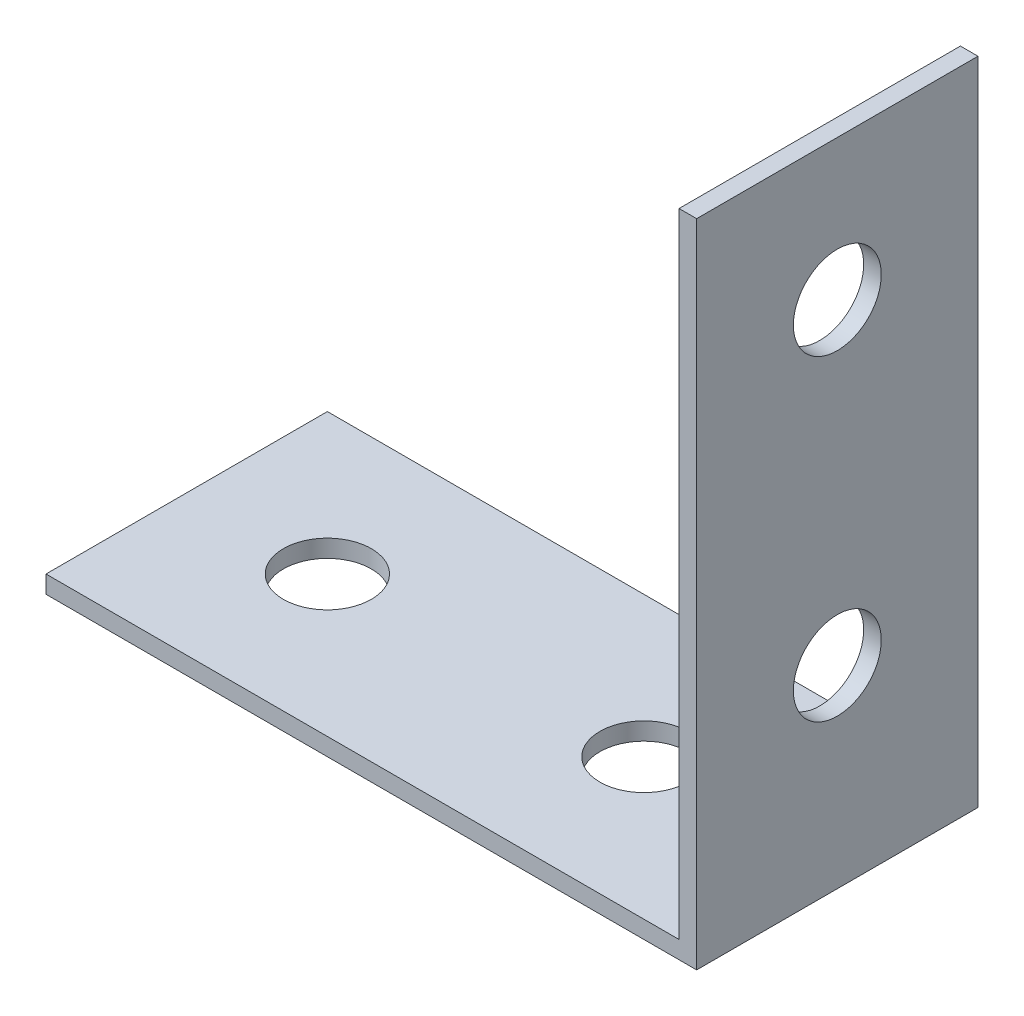
ISO-10303-21;
HEADER;
FILE_DESCRIPTION(('STEP AP214'),'2;1');
FILE_NAME('part.step','',(''),(''),'','','');
FILE_SCHEMA(('AUTOMOTIVE_DESIGN { 1 0 10303 214 1 1 1 1 }'));
ENDSEC;
DATA;
#1=APPLICATION_CONTEXT('core data for automotive mechanical design processes');
#2=APPLICATION_PROTOCOL_DEFINITION('international standard','automotive_design',2000,#1);
#3=PRODUCT_CONTEXT('',#1,'mechanical');
#4=PRODUCT('Part','Part','',(#3));
#5=PRODUCT_RELATED_PRODUCT_CATEGORY('part','',(#4));
#6=PRODUCT_DEFINITION_FORMATION('','',#4);
#7=PRODUCT_DEFINITION_CONTEXT('part definition',#1,'design');
#8=PRODUCT_DEFINITION('design','',#6,#7);
#9=PRODUCT_DEFINITION_SHAPE('','',#8);
#10=(LENGTH_UNIT() NAMED_UNIT(*) SI_UNIT(.MILLI.,.METRE.));
#11=(NAMED_UNIT(*) PLANE_ANGLE_UNIT() SI_UNIT($,.RADIAN.));
#12=(NAMED_UNIT(*) SI_UNIT($,.STERADIAN.) SOLID_ANGLE_UNIT());
#13=UNCERTAINTY_MEASURE_WITH_UNIT(LENGTH_MEASURE(1.E-05),#10,'distance_accuracy_value','');
#14=(GEOMETRIC_REPRESENTATION_CONTEXT(3) GLOBAL_UNCERTAINTY_ASSIGNED_CONTEXT((#13)) GLOBAL_UNIT_ASSIGNED_CONTEXT((#10,
#11,#12)) REPRESENTATION_CONTEXT('',''));
#15=CARTESIAN_POINT('',(0.,0.,0.));
#16=DIRECTION('',(0.,0.,1.));
#17=DIRECTION('',(1.,0.,0.));
#18=AXIS2_PLACEMENT_3D('',#15,#16,#17);
#19=CARTESIAN_POINT('',(-18.,1.,-8.));
#20=DIRECTION('',(0.,0.,1.));
#21=DIRECTION('',(1.,0.,0.));
#22=AXIS2_PLACEMENT_3D('',#19,#20,#21);
#23=PLANE('',#22);
#24=DIRECTION('',(-1.,0.,0.));
#25=VECTOR('',#24,1.);
#26=CARTESIAN_POINT('',(-18.,0.,-8.));
#27=LINE('',#26,#25);
#28=CARTESIAN_POINT('',(19.,0.,-8.));
#29=VERTEX_POINT('',#28);
#30=CARTESIAN_POINT('',(-18.,0.,-8.));
#31=VERTEX_POINT('',#30);
#32=EDGE_CURVE('E65',#29,#31,#27,.T.);
#33=ORIENTED_EDGE('',*,*,#32,.T.);
#34=DIRECTION('',(0.,-1.,0.));
#35=VECTOR('',#34,1.);
#36=CARTESIAN_POINT('',(-18.,1.,-8.));
#37=LINE('',#36,#35);
#38=CARTESIAN_POINT('',(-18.,1.,-8.));
#39=VERTEX_POINT('',#38);
#40=EDGE_CURVE('E11',#39,#31,#37,.T.);
#41=ORIENTED_EDGE('',*,*,#40,.F.);
#42=DIRECTION('',(-1.,0.,0.));
#43=VECTOR('',#42,1.);
#44=CARTESIAN_POINT('',(-18.,1.,-8.));
#45=LINE('',#44,#43);
#46=CARTESIAN_POINT('',(18.,1.,-8.));
#47=VERTEX_POINT('',#46);
#48=EDGE_CURVE('E94',#47,#39,#45,.T.);
#49=ORIENTED_EDGE('',*,*,#48,.F.);
#50=DIRECTION('',(0.,1.,0.));
#51=VECTOR('',#50,1.);
#52=CARTESIAN_POINT('',(18.,0.,-8.));
#53=LINE('',#52,#51);
#54=CARTESIAN_POINT('',(18.,37.,-8.));
#55=VERTEX_POINT('',#54);
#56=EDGE_CURVE('E84',#47,#55,#53,.T.);
#57=ORIENTED_EDGE('',*,*,#56,.T.);
#58=DIRECTION('',(-1.,0.,0.));
#59=VECTOR('',#58,1.);
#60=CARTESIAN_POINT('',(19.,37.,-8.));
#61=LINE('',#60,#59);
#62=CARTESIAN_POINT('',(19.,37.,-8.));
#63=VERTEX_POINT('',#62);
#64=EDGE_CURVE('E105',#63,#55,#61,.T.);
#65=ORIENTED_EDGE('',*,*,#64,.F.);
#66=DIRECTION('',(0.,1.,0.));
#67=VECTOR('',#66,1.);
#68=CARTESIAN_POINT('',(19.,0.,-8.));
#69=LINE('',#68,#67);
#70=EDGE_CURVE('E129',#29,#63,#69,.T.);
#71=ORIENTED_EDGE('',*,*,#70,.F.);
#72=EDGE_LOOP('',(#33,#41,#49,#57,#65,#71));
#73=FACE_BOUND('',#72,.T.);
#74=ADVANCED_FACE('F37',(#73),#23,.F.);
#75=CARTESIAN_POINT('',(-18.,1.,-8.));
#76=DIRECTION('',(1.,0.,0.));
#77=DIRECTION('',(0.,0.,-1.));
#78=AXIS2_PLACEMENT_3D('',#75,#76,#77);
#79=PLANE('',#78);
#80=DIRECTION('',(0.,0.,1.));
#81=VECTOR('',#80,1.);
#82=CARTESIAN_POINT('',(-18.,0.,-8.));
#83=LINE('',#82,#81);
#84=CARTESIAN_POINT('',(-18.,0.,8.));
#85=VERTEX_POINT('',#84);
#86=EDGE_CURVE('E102',#31,#85,#83,.T.);
#87=ORIENTED_EDGE('',*,*,#86,.T.);
#88=DIRECTION('',(0.,-1.,0.));
#89=VECTOR('',#88,1.);
#90=CARTESIAN_POINT('',(-18.,1.,8.));
#91=LINE('',#90,#89);
#92=CARTESIAN_POINT('',(-18.,1.,8.));
#93=VERTEX_POINT('',#92);
#94=EDGE_CURVE('E45',#93,#85,#91,.T.);
#95=ORIENTED_EDGE('',*,*,#94,.F.);
#96=DIRECTION('',(0.,0.,1.));
#97=VECTOR('',#96,1.);
#98=CARTESIAN_POINT('',(-18.,1.,-8.));
#99=LINE('',#98,#97);
#100=EDGE_CURVE('E53',#39,#93,#99,.T.);
#101=ORIENTED_EDGE('',*,*,#100,.F.);
#102=ORIENTED_EDGE('',*,*,#40,.T.);
#103=EDGE_LOOP('',(#87,#95,#101,#102));
#104=FACE_BOUND('',#103,.T.);
#105=ADVANCED_FACE('F164',(#104),#79,.F.);
#106=CARTESIAN_POINT('',(-18.,1.,8.));
#107=DIRECTION('',(0.,0.,-1.));
#108=DIRECTION('',(-1.,0.,0.));
#109=AXIS2_PLACEMENT_3D('',#106,#107,#108);
#110=PLANE('',#109);
#111=DIRECTION('',(1.,0.,0.));
#112=VECTOR('',#111,1.);
#113=CARTESIAN_POINT('',(-18.,0.,8.));
#114=LINE('',#113,#112);
#115=CARTESIAN_POINT('',(19.,0.,8.));
#116=VERTEX_POINT('',#115);
#117=EDGE_CURVE('E99',#85,#116,#114,.T.);
#118=ORIENTED_EDGE('',*,*,#117,.T.);
#119=DIRECTION('',(0.,-1.,0.));
#120=VECTOR('',#119,1.);
#121=CARTESIAN_POINT('',(19.,0.,8.));
#122=LINE('',#121,#120);
#123=CARTESIAN_POINT('',(19.,37.,8.));
#124=VERTEX_POINT('',#123);
#125=EDGE_CURVE('E130',#124,#116,#122,.T.);
#126=ORIENTED_EDGE('',*,*,#125,.F.);
#127=DIRECTION('',(-1.,0.,0.));
#128=VECTOR('',#127,1.);
#129=CARTESIAN_POINT('',(19.,37.,8.));
#130=LINE('',#129,#128);
#131=CARTESIAN_POINT('',(18.,37.,8.));
#132=VERTEX_POINT('',#131);
#133=EDGE_CURVE('E145',#124,#132,#130,.T.);
#134=ORIENTED_EDGE('',*,*,#133,.T.);
#135=DIRECTION('',(0.,-1.,0.));
#136=VECTOR('',#135,1.);
#137=CARTESIAN_POINT('',(18.,0.,8.));
#138=LINE('',#137,#136);
#139=CARTESIAN_POINT('',(18.,1.,8.));
#140=VERTEX_POINT('',#139);
#141=EDGE_CURVE('E92',#132,#140,#138,.T.);
#142=ORIENTED_EDGE('',*,*,#141,.T.);
#143=DIRECTION('',(1.,0.,0.));
#144=VECTOR('',#143,1.);
#145=CARTESIAN_POINT('',(-18.,1.,8.));
#146=LINE('',#145,#144);
#147=EDGE_CURVE('E98',#93,#140,#146,.T.);
#148=ORIENTED_EDGE('',*,*,#147,.F.);
#149=ORIENTED_EDGE('',*,*,#94,.T.);
#150=EDGE_LOOP('',(#118,#126,#134,#142,#148,#149));
#151=FACE_BOUND('',#150,.T.);
#152=ADVANCED_FACE('F114',(#151),#110,.F.);
#153=CARTESIAN_POINT('',(0.,1.,0.));
#154=DIRECTION('',(0.,1.,0.));
#155=DIRECTION('',(0.,0.,1.));
#156=AXIS2_PLACEMENT_3D('',#153,#154,#155);
#157=PLANE('',#156);
#158=CARTESIAN_POINT('',(-10.,1.,0.));
#159=DIRECTION('',(0.,1.,0.));
#160=DIRECTION('',(0.,0.,1.));
#161=AXIS2_PLACEMENT_3D('',#158,#159,#160);
#162=CIRCLE('',#161,2.5);
#163=CARTESIAN_POINT('',(-10.,1.,2.5));
#164=VERTEX_POINT('',#163);
#165=EDGE_CURVE('E182',#164,#164,#162,.T.);
#166=ORIENTED_EDGE('',*,*,#165,.F.);
#167=EDGE_LOOP('',(#166));
#168=FACE_BOUND('',#167,.T.);
#169=CARTESIAN_POINT('',(8.,1.,0.));
#170=DIRECTION('',(0.,1.,0.));
#171=DIRECTION('',(0.,0.,1.));
#172=AXIS2_PLACEMENT_3D('',#169,#170,#171);
#173=CIRCLE('',#172,2.5);
#174=CARTESIAN_POINT('',(8.,1.,2.5));
#175=VERTEX_POINT('',#174);
#176=EDGE_CURVE('E185',#175,#175,#173,.T.);
#177=ORIENTED_EDGE('',*,*,#176,.F.);
#178=EDGE_LOOP('',(#177));
#179=FACE_BOUND('',#178,.T.);
#180=DIRECTION('',(0.,0.,-1.));
#181=VECTOR('',#180,1.);
#182=CARTESIAN_POINT('',(18.,1.,-8.));
#183=LINE('',#182,#181);
#184=EDGE_CURVE('E74',#140,#47,#183,.T.);
#185=ORIENTED_EDGE('',*,*,#184,.T.);
#186=ORIENTED_EDGE('',*,*,#48,.T.);
#187=ORIENTED_EDGE('',*,*,#100,.T.);
#188=ORIENTED_EDGE('',*,*,#147,.T.);
#189=EDGE_LOOP('',(#185,#186,#187,#188));
#190=FACE_BOUND('',#189,.T.);
#191=ADVANCED_FACE('F96',(#168,#179,#190),#157,.T.);
#192=CARTESIAN_POINT('',(0.,0.,0.));
#193=DIRECTION('',(0.,1.,0.));
#194=DIRECTION('',(0.,0.,1.));
#195=AXIS2_PLACEMENT_3D('',#192,#193,#194);
#196=PLANE('',#195);
#197=CARTESIAN_POINT('',(-10.,0.,0.));
#198=DIRECTION('',(0.,1.,0.));
#199=DIRECTION('',(0.,0.,1.));
#200=AXIS2_PLACEMENT_3D('',#197,#198,#199);
#201=CIRCLE('',#200,2.5);
#202=CARTESIAN_POINT('',(-10.,0.,2.5));
#203=VERTEX_POINT('',#202);
#204=EDGE_CURVE('E146',#203,#203,#201,.F.);
#205=ORIENTED_EDGE('',*,*,#204,.F.);
#206=EDGE_LOOP('',(#205));
#207=FACE_BOUND('',#206,.T.);
#208=CARTESIAN_POINT('',(8.,0.,0.));
#209=DIRECTION('',(0.,1.,0.));
#210=DIRECTION('',(0.,0.,1.));
#211=AXIS2_PLACEMENT_3D('',#208,#209,#210);
#212=CIRCLE('',#211,2.5);
#213=CARTESIAN_POINT('',(8.,0.,2.5));
#214=VERTEX_POINT('',#213);
#215=EDGE_CURVE('E140',#214,#214,#212,.F.);
#216=ORIENTED_EDGE('',*,*,#215,.F.);
#217=EDGE_LOOP('',(#216));
#218=FACE_BOUND('',#217,.T.);
#219=ORIENTED_EDGE('',*,*,#32,.F.);
#220=DIRECTION('',(0.,0.,-1.));
#221=VECTOR('',#220,1.);
#222=CARTESIAN_POINT('',(19.,0.,8.));
#223=LINE('',#222,#221);
#224=EDGE_CURVE('E123',#116,#29,#223,.T.);
#225=ORIENTED_EDGE('',*,*,#224,.F.);
#226=ORIENTED_EDGE('',*,*,#117,.F.);
#227=ORIENTED_EDGE('',*,*,#86,.F.);
#228=EDGE_LOOP('',(#219,#225,#226,#227));
#229=FACE_BOUND('',#228,.T.);
#230=ADVANCED_FACE('F121',(#207,#218,#229),#196,.F.);
#231=CARTESIAN_POINT('',(18.,0.,0.));
#232=DIRECTION('',(-1.,0.,0.));
#233=DIRECTION('',(0.,0.,1.));
#234=AXIS2_PLACEMENT_3D('',#231,#232,#233);
#235=PLANE('',#234);
#236=CARTESIAN_POINT('',(18.,29.,0.));
#237=DIRECTION('',(-1.,0.,0.));
#238=DIRECTION('',(0.,0.,1.));
#239=AXIS2_PLACEMENT_3D('',#236,#237,#238);
#240=CIRCLE('',#239,2.5);
#241=CARTESIAN_POINT('',(18.,29.,2.5));
#242=VERTEX_POINT('',#241);
#243=EDGE_CURVE('E190',#242,#242,#240,.T.);
#244=ORIENTED_EDGE('',*,*,#243,.F.);
#245=EDGE_LOOP('',(#244));
#246=FACE_BOUND('',#245,.T.);
#247=CARTESIAN_POINT('',(18.,11.,0.));
#248=DIRECTION('',(-1.,0.,0.));
#249=DIRECTION('',(0.,0.,1.));
#250=AXIS2_PLACEMENT_3D('',#247,#248,#249);
#251=CIRCLE('',#250,2.5);
#252=CARTESIAN_POINT('',(18.,11.,2.5));
#253=VERTEX_POINT('',#252);
#254=EDGE_CURVE('E199',#253,#253,#251,.T.);
#255=ORIENTED_EDGE('',*,*,#254,.F.);
#256=EDGE_LOOP('',(#255));
#257=FACE_BOUND('',#256,.T.);
#258=ORIENTED_EDGE('',*,*,#184,.F.);
#259=ORIENTED_EDGE('',*,*,#141,.F.);
#260=DIRECTION('',(0.,0.,1.));
#261=VECTOR('',#260,1.);
#262=CARTESIAN_POINT('',(18.,37.,8.));
#263=LINE('',#262,#261);
#264=EDGE_CURVE('E89',#55,#132,#263,.T.);
#265=ORIENTED_EDGE('',*,*,#264,.F.);
#266=ORIENTED_EDGE('',*,*,#56,.F.);
#267=EDGE_LOOP('',(#258,#259,#265,#266));
#268=FACE_BOUND('',#267,.T.);
#269=ADVANCED_FACE('F86',(#246,#257,#268),#235,.T.);
#270=CARTESIAN_POINT('',(19.,37.,8.));
#271=DIRECTION('',(0.,-1.,0.));
#272=DIRECTION('',(0.,0.,-1.));
#273=AXIS2_PLACEMENT_3D('',#270,#271,#272);
#274=PLANE('',#273);
#275=ORIENTED_EDGE('',*,*,#264,.T.);
#276=ORIENTED_EDGE('',*,*,#133,.F.);
#277=DIRECTION('',(0.,0.,1.));
#278=VECTOR('',#277,1.);
#279=CARTESIAN_POINT('',(19.,37.,8.));
#280=LINE('',#279,#278);
#281=EDGE_CURVE('E134',#63,#124,#280,.T.);
#282=ORIENTED_EDGE('',*,*,#281,.F.);
#283=ORIENTED_EDGE('',*,*,#64,.T.);
#284=EDGE_LOOP('',(#275,#276,#282,#283));
#285=FACE_BOUND('',#284,.T.);
#286=ADVANCED_FACE('F148',(#285),#274,.F.);
#287=CARTESIAN_POINT('',(19.,0.,0.));
#288=DIRECTION('',(-1.,0.,0.));
#289=DIRECTION('',(0.,0.,1.));
#290=AXIS2_PLACEMENT_3D('',#287,#288,#289);
#291=PLANE('',#290);
#292=CARTESIAN_POINT('',(19.,29.,0.));
#293=DIRECTION('',(-1.,0.,0.));
#294=DIRECTION('',(0.,0.,1.));
#295=AXIS2_PLACEMENT_3D('',#292,#293,#294);
#296=CIRCLE('',#295,2.5);
#297=CARTESIAN_POINT('',(19.,29.,2.5));
#298=VERTEX_POINT('',#297);
#299=EDGE_CURVE('E187',#298,#298,#296,.F.);
#300=ORIENTED_EDGE('',*,*,#299,.F.);
#301=EDGE_LOOP('',(#300));
#302=FACE_BOUND('',#301,.T.);
#303=CARTESIAN_POINT('',(19.,11.,0.));
#304=DIRECTION('',(-1.,0.,0.));
#305=DIRECTION('',(0.,0.,1.));
#306=AXIS2_PLACEMENT_3D('',#303,#304,#305);
#307=CIRCLE('',#306,2.5);
#308=CARTESIAN_POINT('',(19.,11.,2.5));
#309=VERTEX_POINT('',#308);
#310=EDGE_CURVE('E196',#309,#309,#307,.F.);
#311=ORIENTED_EDGE('',*,*,#310,.F.);
#312=EDGE_LOOP('',(#311));
#313=FACE_BOUND('',#312,.T.);
#314=ORIENTED_EDGE('',*,*,#125,.T.);
#315=ORIENTED_EDGE('',*,*,#224,.T.);
#316=ORIENTED_EDGE('',*,*,#70,.T.);
#317=ORIENTED_EDGE('',*,*,#281,.T.);
#318=EDGE_LOOP('',(#314,#315,#316,#317));
#319=FACE_BOUND('',#318,.T.);
#320=ADVANCED_FACE('F132',(#302,#313,#319),#291,.F.);
#321=CARTESIAN_POINT('',(8.,-0.000999999999999916,0.));
#322=DIRECTION('',(0.,1.,0.));
#323=DIRECTION('',(0.,0.,1.));
#324=AXIS2_PLACEMENT_3D('',#321,#322,#323);
#325=CYLINDRICAL_SURFACE('',#324,2.5);
#326=ORIENTED_EDGE('',*,*,#176,.T.);
#327=EDGE_LOOP('',(#326));
#328=FACE_BOUND('',#327,.T.);
#329=ORIENTED_EDGE('',*,*,#215,.T.);
#330=EDGE_LOOP('',(#329));
#331=FACE_BOUND('',#330,.T.);
#332=ADVANCED_FACE('F157',(#328,#331),#325,.F.);
#333=CARTESIAN_POINT('',(-10.,-0.000999999999999916,0.));
#334=DIRECTION('',(0.,1.,0.));
#335=DIRECTION('',(0.,0.,1.));
#336=AXIS2_PLACEMENT_3D('',#333,#334,#335);
#337=CYLINDRICAL_SURFACE('',#336,2.5);
#338=ORIENTED_EDGE('',*,*,#165,.T.);
#339=EDGE_LOOP('',(#338));
#340=FACE_BOUND('',#339,.T.);
#341=ORIENTED_EDGE('',*,*,#204,.T.);
#342=EDGE_LOOP('',(#341));
#343=FACE_BOUND('',#342,.T.);
#344=ADVANCED_FACE('F213',(#340,#343),#337,.F.);
#345=CARTESIAN_POINT('',(19.001,11.,0.));
#346=DIRECTION('',(-1.,0.,0.));
#347=DIRECTION('',(0.,0.,1.));
#348=AXIS2_PLACEMENT_3D('',#345,#346,#347);
#349=CYLINDRICAL_SURFACE('',#348,2.5);
#350=CARTESIAN_POINT('',(18.,11.,2.5));
#351=CARTESIAN_POINT('',(18.0104166666667,11.,2.5));
#352=CARTESIAN_POINT('',(18.0208333333333,11.,2.5));
#353=CARTESIAN_POINT('',(18.0416666666667,11.,2.5));
#354=CARTESIAN_POINT('',(18.0520833333333,11.,2.5));
#355=CARTESIAN_POINT('',(18.0729166666667,11.,2.5));
#356=CARTESIAN_POINT('',(18.0833333333333,11.,2.5));
#357=CARTESIAN_POINT('',(18.1041666666667,11.,2.5));
#358=CARTESIAN_POINT('',(18.1145833333333,11.,2.5));
#359=CARTESIAN_POINT('',(18.1354166666667,11.,2.5));
#360=CARTESIAN_POINT('',(18.1458333333333,11.,2.5));
#361=CARTESIAN_POINT('',(18.1666666666667,11.,2.5));
#362=CARTESIAN_POINT('',(18.1770833333333,11.,2.5));
#363=CARTESIAN_POINT('',(18.1979166666667,11.,2.5));
#364=CARTESIAN_POINT('',(18.2083333333333,11.,2.5));
#365=CARTESIAN_POINT('',(18.2291666666667,11.,2.5));
#366=CARTESIAN_POINT('',(18.2395833333333,11.,2.5));
#367=CARTESIAN_POINT('',(18.2604166666667,11.,2.5));
#368=CARTESIAN_POINT('',(18.2708333333333,11.,2.5));
#369=CARTESIAN_POINT('',(18.2916666666667,11.,2.5));
#370=CARTESIAN_POINT('',(18.3020833333333,11.,2.5));
#371=CARTESIAN_POINT('',(18.3229166666667,11.,2.5));
#372=CARTESIAN_POINT('',(18.3333333333333,11.,2.5));
#373=CARTESIAN_POINT('',(18.3541666666667,11.,2.5));
#374=CARTESIAN_POINT('',(18.3645833333333,11.,2.5));
#375=CARTESIAN_POINT('',(18.3854166666667,11.,2.5));
#376=CARTESIAN_POINT('',(18.3958333333333,11.,2.5));
#377=CARTESIAN_POINT('',(18.4166666666667,11.,2.5));
#378=CARTESIAN_POINT('',(18.4270833333333,11.,2.5));
#379=CARTESIAN_POINT('',(18.4479166666667,11.,2.5));
#380=CARTESIAN_POINT('',(18.4583333333333,11.,2.5));
#381=CARTESIAN_POINT('',(18.4791666666667,11.,2.5));
#382=CARTESIAN_POINT('',(18.4895833333333,11.,2.5));
#383=CARTESIAN_POINT('',(18.5104166666667,11.,2.5));
#384=CARTESIAN_POINT('',(18.5208333333333,11.,2.5));
#385=CARTESIAN_POINT('',(18.5416666666667,11.,2.5));
#386=CARTESIAN_POINT('',(18.5520833333333,11.,2.5));
#387=CARTESIAN_POINT('',(18.5729166666667,11.,2.5));
#388=CARTESIAN_POINT('',(18.5833333333333,11.,2.5));
#389=CARTESIAN_POINT('',(18.6041666666667,11.,2.5));
#390=CARTESIAN_POINT('',(18.6145833333333,11.,2.5));
#391=CARTESIAN_POINT('',(18.6354166666667,11.,2.5));
#392=CARTESIAN_POINT('',(18.6458333333333,11.,2.5));
#393=CARTESIAN_POINT('',(18.6666666666667,11.,2.5));
#394=CARTESIAN_POINT('',(18.6770833333333,11.,2.5));
#395=CARTESIAN_POINT('',(18.6979166666667,11.,2.5));
#396=CARTESIAN_POINT('',(18.7083333333333,11.,2.5));
#397=CARTESIAN_POINT('',(18.7291666666667,11.,2.5));
#398=CARTESIAN_POINT('',(18.7395833333333,11.,2.5));
#399=CARTESIAN_POINT('',(18.7604166666667,11.,2.5));
#400=CARTESIAN_POINT('',(18.7708333333333,11.,2.5));
#401=CARTESIAN_POINT('',(18.7916666666667,11.,2.5));
#402=CARTESIAN_POINT('',(18.8020833333333,11.,2.5));
#403=CARTESIAN_POINT('',(18.8229166666667,11.,2.5));
#404=CARTESIAN_POINT('',(18.8333333333333,11.,2.5));
#405=CARTESIAN_POINT('',(18.8541666666667,11.,2.5));
#406=CARTESIAN_POINT('',(18.8645833333333,11.,2.5));
#407=CARTESIAN_POINT('',(18.8854166666667,11.,2.5));
#408=CARTESIAN_POINT('',(18.8958333333333,11.,2.5));
#409=CARTESIAN_POINT('',(18.9166666666667,11.,2.5));
#410=CARTESIAN_POINT('',(18.9270833333333,11.,2.5));
#411=CARTESIAN_POINT('',(18.9479166666667,11.,2.5));
#412=CARTESIAN_POINT('',(18.9583333333333,11.,2.5));
#413=CARTESIAN_POINT('',(18.9791666666667,11.,2.5));
#414=CARTESIAN_POINT('',(18.9895833333333,11.,2.5));
#415=CARTESIAN_POINT('',(19.,11.,2.5));
#416=B_SPLINE_CURVE_WITH_KNOTS('',3,(#350,#351,#352,#353,#354,#355,#356,#357,#358,#359,#360,
#361,#362,#363,#364,#365,#366,#367,#368,#369,#370,#371,#372,#373,#374,#375,#376,#377,#378,#379,
#380,#381,#382,#383,#384,#385,#386,#387,#388,#389,#390,#391,#392,#393,#394,#395,#396,#397,#398,
#399,#400,#401,#402,#403,#404,#405,#406,#407,#408,#409,#410,#411,#412,#413,#414,#415),
.UNSPECIFIED.,.F.,.F.,(4,2,2,2,2,2,2,2,2,2,2,2,2,2,2,2,2,2,2,2,2,2,2,2,2,2,2,2,2,2,2,2,4),(0.,
0.03125,0.0625000000000001,0.0937500000000001,0.125,0.15625,0.1875,0.21875,0.25,0.28125,0.3125,
0.34375,0.375,0.40625,0.4375,0.46875,0.5,0.53125,0.5625,0.593750000000001,0.625000000000001,
0.656250000000001,0.687500000000001,0.718750000000001,0.750000000000001,0.781250000000001,
0.812500000000001,0.843750000000001,0.875000000000001,0.906250000000001,0.937500000000001,
0.968750000000001,1.),.UNSPECIFIED.);
#417=EDGE_CURVE('BSEAM210',#253,#309,#416,.T.);
#418=ORIENTED_EDGE('',*,*,#254,.T.);
#419=ORIENTED_EDGE('',*,*,#310,.T.);
#420=ORIENTED_EDGE('',*,*,#417,.T.);
#421=ORIENTED_EDGE('',*,*,#417,.F.);
#422=EDGE_LOOP('',(#418,#420,#419,#421));
#423=FACE_BOUND('',#422,.T.);
#424=ADVANCED_FACE('F210',(#423),#349,.F.);
#425=CARTESIAN_POINT('',(19.001,29.,0.));
#426=DIRECTION('',(-1.,0.,0.));
#427=DIRECTION('',(0.,0.,1.));
#428=AXIS2_PLACEMENT_3D('',#425,#426,#427);
#429=CYLINDRICAL_SURFACE('',#428,2.5);
#430=CARTESIAN_POINT('',(18.,29.,2.5));
#431=CARTESIAN_POINT('',(18.0104166666667,29.,2.5));
#432=CARTESIAN_POINT('',(18.0208333333333,29.,2.5));
#433=CARTESIAN_POINT('',(18.0416666666667,29.,2.5));
#434=CARTESIAN_POINT('',(18.0520833333333,29.,2.5));
#435=CARTESIAN_POINT('',(18.0729166666667,29.,2.5));
#436=CARTESIAN_POINT('',(18.0833333333333,29.,2.5));
#437=CARTESIAN_POINT('',(18.1041666666667,29.,2.5));
#438=CARTESIAN_POINT('',(18.1145833333333,29.,2.5));
#439=CARTESIAN_POINT('',(18.1354166666667,29.,2.5));
#440=CARTESIAN_POINT('',(18.1458333333333,29.,2.5));
#441=CARTESIAN_POINT('',(18.1666666666667,29.,2.5));
#442=CARTESIAN_POINT('',(18.1770833333333,29.,2.5));
#443=CARTESIAN_POINT('',(18.1979166666667,29.,2.5));
#444=CARTESIAN_POINT('',(18.2083333333333,29.,2.5));
#445=CARTESIAN_POINT('',(18.2291666666667,29.,2.5));
#446=CARTESIAN_POINT('',(18.2395833333333,29.,2.5));
#447=CARTESIAN_POINT('',(18.2604166666667,29.,2.5));
#448=CARTESIAN_POINT('',(18.2708333333333,29.,2.5));
#449=CARTESIAN_POINT('',(18.2916666666667,29.,2.5));
#450=CARTESIAN_POINT('',(18.3020833333333,29.,2.5));
#451=CARTESIAN_POINT('',(18.3229166666667,29.,2.5));
#452=CARTESIAN_POINT('',(18.3333333333333,29.,2.5));
#453=CARTESIAN_POINT('',(18.3541666666667,29.,2.5));
#454=CARTESIAN_POINT('',(18.3645833333333,29.,2.5));
#455=CARTESIAN_POINT('',(18.3854166666667,29.,2.5));
#456=CARTESIAN_POINT('',(18.3958333333333,29.,2.5));
#457=CARTESIAN_POINT('',(18.4166666666667,29.,2.5));
#458=CARTESIAN_POINT('',(18.4270833333333,29.,2.5));
#459=CARTESIAN_POINT('',(18.4479166666667,29.,2.5));
#460=CARTESIAN_POINT('',(18.4583333333333,29.,2.5));
#461=CARTESIAN_POINT('',(18.4791666666667,29.,2.5));
#462=CARTESIAN_POINT('',(18.4895833333333,29.,2.5));
#463=CARTESIAN_POINT('',(18.5104166666667,29.,2.5));
#464=CARTESIAN_POINT('',(18.5208333333333,29.,2.5));
#465=CARTESIAN_POINT('',(18.5416666666667,29.,2.5));
#466=CARTESIAN_POINT('',(18.5520833333333,29.,2.5));
#467=CARTESIAN_POINT('',(18.5729166666667,29.,2.5));
#468=CARTESIAN_POINT('',(18.5833333333333,29.,2.5));
#469=CARTESIAN_POINT('',(18.6041666666667,29.,2.5));
#470=CARTESIAN_POINT('',(18.6145833333333,29.,2.5));
#471=CARTESIAN_POINT('',(18.6354166666667,29.,2.5));
#472=CARTESIAN_POINT('',(18.6458333333333,29.,2.5));
#473=CARTESIAN_POINT('',(18.6666666666667,29.,2.5));
#474=CARTESIAN_POINT('',(18.6770833333333,29.,2.5));
#475=CARTESIAN_POINT('',(18.6979166666667,29.,2.5));
#476=CARTESIAN_POINT('',(18.7083333333333,29.,2.5));
#477=CARTESIAN_POINT('',(18.7291666666667,29.,2.5));
#478=CARTESIAN_POINT('',(18.7395833333333,29.,2.5));
#479=CARTESIAN_POINT('',(18.7604166666667,29.,2.5));
#480=CARTESIAN_POINT('',(18.7708333333333,29.,2.5));
#481=CARTESIAN_POINT('',(18.7916666666667,29.,2.5));
#482=CARTESIAN_POINT('',(18.8020833333333,29.,2.5));
#483=CARTESIAN_POINT('',(18.8229166666667,29.,2.5));
#484=CARTESIAN_POINT('',(18.8333333333333,29.,2.5));
#485=CARTESIAN_POINT('',(18.8541666666667,29.,2.5));
#486=CARTESIAN_POINT('',(18.8645833333333,29.,2.5));
#487=CARTESIAN_POINT('',(18.8854166666667,29.,2.5));
#488=CARTESIAN_POINT('',(18.8958333333333,29.,2.5));
#489=CARTESIAN_POINT('',(18.9166666666667,29.,2.5));
#490=CARTESIAN_POINT('',(18.9270833333333,29.,2.5));
#491=CARTESIAN_POINT('',(18.9479166666667,29.,2.5));
#492=CARTESIAN_POINT('',(18.9583333333333,29.,2.5));
#493=CARTESIAN_POINT('',(18.9791666666667,29.,2.5));
#494=CARTESIAN_POINT('',(18.9895833333333,29.,2.5));
#495=CARTESIAN_POINT('',(19.,29.,2.5));
#496=B_SPLINE_CURVE_WITH_KNOTS('',3,(#430,#431,#432,#433,#434,#435,#436,#437,#438,#439,#440,
#441,#442,#443,#444,#445,#446,#447,#448,#449,#450,#451,#452,#453,#454,#455,#456,#457,#458,#459,
#460,#461,#462,#463,#464,#465,#466,#467,#468,#469,#470,#471,#472,#473,#474,#475,#476,#477,#478,
#479,#480,#481,#482,#483,#484,#485,#486,#487,#488,#489,#490,#491,#492,#493,#494,#495),
.UNSPECIFIED.,.F.,.F.,(4,2,2,2,2,2,2,2,2,2,2,2,2,2,2,2,2,2,2,2,2,2,2,2,2,2,2,2,2,2,2,2,4),(0.,
0.03125,0.0625000000000001,0.0937500000000001,0.125,0.15625,0.1875,0.21875,0.25,0.28125,0.3125,
0.34375,0.375,0.40625,0.4375,0.46875,0.5,0.53125,0.5625,0.593750000000001,0.625000000000001,
0.656250000000001,0.687500000000001,0.718750000000001,0.750000000000001,0.781250000000001,
0.812500000000001,0.843750000000001,0.875000000000001,0.906250000000001,0.937500000000001,
0.968750000000001,1.),.UNSPECIFIED.);
#497=EDGE_CURVE('BSEAM205',#242,#298,#496,.T.);
#498=ORIENTED_EDGE('',*,*,#243,.T.);
#499=ORIENTED_EDGE('',*,*,#299,.T.);
#500=ORIENTED_EDGE('',*,*,#497,.T.);
#501=ORIENTED_EDGE('',*,*,#497,.F.);
#502=EDGE_LOOP('',(#498,#500,#499,#501));
#503=FACE_BOUND('',#502,.T.);
#504=ADVANCED_FACE('F205',(#503),#429,.F.);
#505=CLOSED_SHELL('',(#74,#105,#152,#191,#230,#269,#286,#320,#332,#344,#424,#504));
#506=MANIFOLD_SOLID_BREP('B2',#505);
#507=ADVANCED_BREP_SHAPE_REPRESENTATION('',(#18,#506),#14);
#508=SHAPE_DEFINITION_REPRESENTATION(#9,#507);
ENDSEC;
END-ISO-10303-21;
